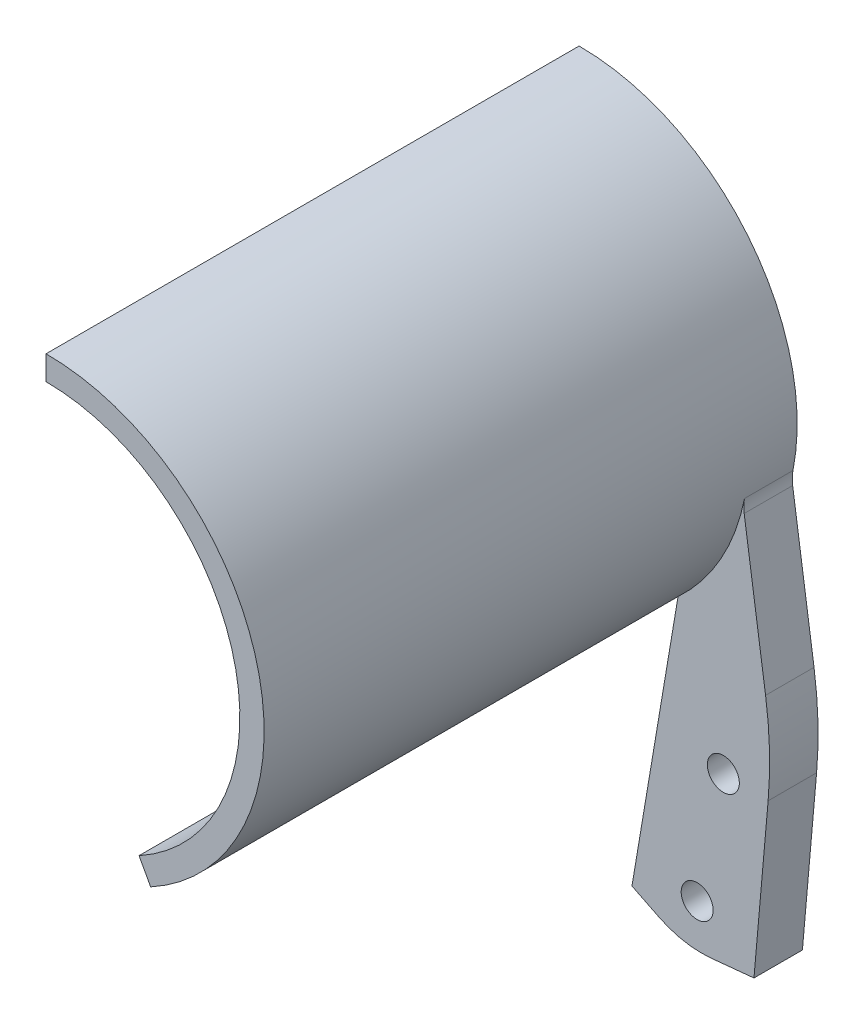
ISO-10303-21;
HEADER;
FILE_DESCRIPTION(('STEP AP214'),'2;1');
FILE_NAME('part.step','',(''),(''),'','','');
FILE_SCHEMA(('AUTOMOTIVE_DESIGN { 1 0 10303 214 1 1 1 1 }'));
ENDSEC;
DATA;
#1=APPLICATION_CONTEXT('core data for automotive mechanical design processes');
#2=APPLICATION_PROTOCOL_DEFINITION('international standard','automotive_design',2000,#1);
#3=PRODUCT_CONTEXT('',#1,'mechanical');
#4=PRODUCT('Part','Part','',(#3));
#5=PRODUCT_RELATED_PRODUCT_CATEGORY('part','',(#4));
#6=PRODUCT_DEFINITION_FORMATION('','',#4);
#7=PRODUCT_DEFINITION_CONTEXT('part definition',#1,'design');
#8=PRODUCT_DEFINITION('design','',#6,#7);
#9=PRODUCT_DEFINITION_SHAPE('','',#8);
#10=(LENGTH_UNIT() NAMED_UNIT(*) SI_UNIT(.MILLI.,.METRE.));
#11=(NAMED_UNIT(*) PLANE_ANGLE_UNIT() SI_UNIT($,.RADIAN.));
#12=(NAMED_UNIT(*) SI_UNIT($,.STERADIAN.) SOLID_ANGLE_UNIT());
#13=UNCERTAINTY_MEASURE_WITH_UNIT(LENGTH_MEASURE(1.E-05),#10,'distance_accuracy_value','');
#14=(GEOMETRIC_REPRESENTATION_CONTEXT(3) GLOBAL_UNCERTAINTY_ASSIGNED_CONTEXT((#13)) GLOBAL_UNIT_ASSIGNED_CONTEXT((#10,
#11,#12)) REPRESENTATION_CONTEXT('',''));
#15=CARTESIAN_POINT('',(0.,0.,0.));
#16=DIRECTION('',(0.,0.,1.));
#17=DIRECTION('',(1.,0.,0.));
#18=AXIS2_PLACEMENT_3D('',#15,#16,#17);
#19=CARTESIAN_POINT('',(-11.5,59.5,5.));
#20=DIRECTION('',(0.,0.,1.));
#21=DIRECTION('',(1.,0.,0.));
#22=AXIS2_PLACEMENT_3D('',#19,#20,#21);
#23=PLANE('',#22);
#24=CARTESIAN_POINT('',(-11.5,59.5,5.));
#25=DIRECTION('',(0.,0.,1.));
#26=DIRECTION('',(1.,0.,0.));
#27=AXIS2_PLACEMENT_3D('',#24,#25,#26);
#28=CIRCLE('',#27,22.5);
#29=CARTESIAN_POINT('',(3.70966057465962,42.9194021457715,5.));
#30=VERTEX_POINT('',#29);
#31=CARTESIAN_POINT('',(10.5660115908317,55.1021445597564,5.));
#32=VERTEX_POINT('',#31);
#33=EDGE_CURVE('E165',#30,#32,#28,.T.);
#34=ORIENTED_EDGE('',*,*,#33,.F.);
#35=DIRECTION('',(-0.166016316911046,-0.986123005775289,0.));
#36=VECTOR('',#35,1.);
#37=CARTESIAN_POINT('',(-1.04711146063493,14.6645750028113,5.));
#38=LINE('',#37,#36);
#39=CARTESIAN_POINT('',(-1.04711146063493,14.6645750028113,5.));
#40=VERTEX_POINT('',#39);
#41=EDGE_CURVE('E191',#30,#40,#38,.T.);
#42=ORIENTED_EDGE('',*,*,#41,.T.);
#43=DIRECTION('',(0.896009897531916,-0.444034079238121,0.));
#44=VECTOR('',#43,1.);
#45=CARTESIAN_POINT('',(-1.04711146063493,14.6645750028113,5.));
#46=LINE('',#45,#44);
#47=CARTESIAN_POINT('',(1.7101956104969,13.2981410941243,5.));
#48=VERTEX_POINT('',#47);
#49=EDGE_CURVE('E181',#40,#48,#46,.T.);
#50=ORIENTED_EDGE('',*,*,#49,.T.);
#51=CARTESIAN_POINT('',(6.15053640287812,22.2582400694434,5.));
#52=DIRECTION('',(0.,0.,1.));
#53=DIRECTION('',(1.,0.,0.));
#54=AXIS2_PLACEMENT_3D('',#51,#52,#53);
#55=CIRCLE('',#54,10.);
#56=CARTESIAN_POINT('',(7.13156192150099,12.3064769627467,5.));
#57=VERTEX_POINT('',#56);
#58=EDGE_CURVE('E11',#48,#57,#55,.T.);
#59=ORIENTED_EDGE('',*,*,#58,.T.);
#60=DIRECTION('',(0.995176310669676,0.0981025518622871,0.));
#61=VECTOR('',#60,1.);
#62=CARTESIAN_POINT('',(4.27874113591349,12.0252514190201,5.));
#63=LINE('',#62,#61);
#64=CARTESIAN_POINT('',(11.5398939036989,12.7410417853546,5.));
#65=VERTEX_POINT('',#64);
#66=EDGE_CURVE('E183',#57,#65,#63,.T.);
#67=ORIENTED_EDGE('',*,*,#66,.T.);
#68=DIRECTION('',(0.087970275032742,0.996123100179222,0.));
#69=VECTOR('',#68,1.);
#70=CARTESIAN_POINT('',(11.5398939036989,12.7410417853546,5.));
#71=LINE('',#70,#69);
#72=CARTESIAN_POINT('',(13.0029741208637,29.3080924304804,5.));
#73=VERTEX_POINT('',#72);
#74=EDGE_CURVE('E186',#65,#73,#71,.T.);
#75=ORIENTED_EDGE('',*,*,#74,.T.);
#76=CARTESIAN_POINT('',(-26.8419498863051,32.82690343179,5.));
#77=DIRECTION('',(0.,0.,1.));
#78=DIRECTION('',(1.,0.,0.));
#79=AXIS2_PLACEMENT_3D('',#76,#77,#78);
#80=CIRCLE('',#79,40.);
#81=CARTESIAN_POINT('',(12.7393102999379,38.5995840975582,5.));
#82=VERTEX_POINT('',#81);
#83=EDGE_CURVE('E242',#73,#82,#80,.T.);
#84=ORIENTED_EDGE('',*,*,#83,.T.);
#85=DIRECTION('',(-0.144317016644205,0.989531504656075,0.));
#86=VECTOR('',#85,1.);
#87=CARTESIAN_POINT('',(13.414614229585,33.9692603204855,5.));
#88=LINE('',#87,#86);
#89=CARTESIAN_POINT('',(10.5307320772442,53.7430355260251,5.));
#90=VERTEX_POINT('',#89);
#91=EDGE_CURVE('E189',#82,#90,#88,.T.);
#92=ORIENTED_EDGE('',*,*,#91,.T.);
#93=CARTESIAN_POINT('',(14.4888580958685,54.320303592602,5.));
#94=DIRECTION('',(0.,0.,1.));
#95=DIRECTION('',(1.,0.,0.));
#96=AXIS2_PLACEMENT_3D('',#93,#94,#95);
#97=CIRCLE('',#96,4.);
#98=EDGE_CURVE('E233',#90,#32,#97,.F.);
#99=ORIENTED_EDGE('',*,*,#98,.T.);
#100=EDGE_LOOP('',(#34,#42,#50,#59,#67,#75,#84,#92,#99));
#101=FACE_BOUND('',#100,.T.);
#102=CARTESIAN_POINT('',(5.67947549244537,16.6837506273747,5.));
#103=DIRECTION('',(0.,0.,1.));
#104=DIRECTION('',(1.,0.,0.));
#105=AXIS2_PLACEMENT_3D('',#102,#103,#104);
#106=CIRCLE('',#105,1.65);
#107=CARTESIAN_POINT('',(7.32947549244537,16.6837506273747,5.));
#108=VERTEX_POINT('',#107);
#109=EDGE_CURVE('E175',#108,#108,#106,.T.);
#110=ORIENTED_EDGE('',*,*,#109,.F.);
#111=EDGE_LOOP('',(#110));
#112=FACE_BOUND('',#111,.T.);
#113=CARTESIAN_POINT('',(8.38232747307616,29.3996694369142,5.));
#114=DIRECTION('',(0.,0.,1.));
#115=DIRECTION('',(1.,0.,0.));
#116=AXIS2_PLACEMENT_3D('',#113,#114,#115);
#117=CIRCLE('',#116,1.65);
#118=CARTESIAN_POINT('',(10.0323274730762,29.3996694369142,5.));
#119=VERTEX_POINT('',#118);
#120=EDGE_CURVE('E169',#119,#119,#117,.T.);
#121=ORIENTED_EDGE('',*,*,#120,.F.);
#122=EDGE_LOOP('',(#121));
#123=FACE_BOUND('',#122,.T.);
#124=ADVANCED_FACE('F39',(#101,#112,#123),#23,.T.);
#125=CARTESIAN_POINT('',(-11.5,59.5,0.));
#126=DIRECTION('',(0.,0.,1.));
#127=DIRECTION('',(1.,0.,0.));
#128=AXIS2_PLACEMENT_3D('',#125,#126,#127);
#129=PLANE('',#128);
#130=DIRECTION('',(-0.166016316911046,-0.986123005775289,0.));
#131=VECTOR('',#130,1.);
#132=CARTESIAN_POINT('',(-1.04711146063493,14.6645750028113,0.));
#133=LINE('',#132,#131);
#134=CARTESIAN_POINT('',(3.70966057465962,42.9194021457715,0.));
#135=VERTEX_POINT('',#134);
#136=CARTESIAN_POINT('',(-1.04711146063493,14.6645750028113,0.));
#137=VERTEX_POINT('',#136);
#138=EDGE_CURVE('E184',#135,#137,#133,.T.);
#139=ORIENTED_EDGE('',*,*,#138,.F.);
#140=CARTESIAN_POINT('',(-11.5,59.5,0.));
#141=DIRECTION('',(0.,0.,1.));
#142=DIRECTION('',(1.,0.,0.));
#143=AXIS2_PLACEMENT_3D('',#140,#141,#142);
#144=CIRCLE('',#143,22.5);
#145=CARTESIAN_POINT('',(-0.707567867346551,39.7573201246115,0.));
#146=VERTEX_POINT('',#145);
#147=EDGE_CURVE('E209',#146,#135,#144,.T.);
#148=ORIENTED_EDGE('',*,*,#147,.F.);
#149=DIRECTION('',(0.479663650340153,-0.877452438906155,0.));
#150=VECTOR('',#149,1.);
#151=CARTESIAN_POINT('',(-0.70756786734655,39.7573201246115,0.));
#152=LINE('',#151,#150);
#153=CARTESIAN_POINT('',(-1.90672699319694,41.9509512218769,0.));
#154=VERTEX_POINT('',#153);
#155=EDGE_CURVE('E140',#154,#146,#152,.T.);
#156=ORIENTED_EDGE('',*,*,#155,.F.);
#157=CARTESIAN_POINT('',(-11.5,59.5,0.));
#158=DIRECTION('',(0.,0.,-1.));
#159=DIRECTION('',(1.,0.,0.));
#160=AXIS2_PLACEMENT_3D('',#157,#158,#159);
#161=CIRCLE('',#160,20.);
#162=CARTESIAN_POINT('',(-11.5,79.5,0.));
#163=VERTEX_POINT('',#162);
#164=EDGE_CURVE('E206',#163,#154,#161,.T.);
#165=ORIENTED_EDGE('',*,*,#164,.F.);
#166=DIRECTION('',(0.,-1.,0.));
#167=VECTOR('',#166,1.);
#168=CARTESIAN_POINT('',(-11.5,79.5,0.));
#169=LINE('',#168,#167);
#170=CARTESIAN_POINT('',(-11.5,82.,0.));
#171=VERTEX_POINT('',#170);
#172=EDGE_CURVE('E204',#171,#163,#169,.T.);
#173=ORIENTED_EDGE('',*,*,#172,.F.);
#174=CARTESIAN_POINT('',(-11.5,59.5,0.));
#175=DIRECTION('',(0.,0.,1.));
#176=DIRECTION('',(1.,0.,0.));
#177=AXIS2_PLACEMENT_3D('',#174,#175,#176);
#178=CIRCLE('',#177,22.5);
#179=CARTESIAN_POINT('',(10.5660115908317,55.1021445597564,0.));
#180=VERTEX_POINT('',#179);
#181=EDGE_CURVE('E202',#180,#171,#178,.T.);
#182=ORIENTED_EDGE('',*,*,#181,.F.);
#183=CARTESIAN_POINT('',(14.4888580958685,54.320303592602,0.));
#184=DIRECTION('',(0.,0.,1.));
#185=DIRECTION('',(1.,0.,0.));
#186=AXIS2_PLACEMENT_3D('',#183,#184,#185);
#187=CIRCLE('',#186,4.);
#188=CARTESIAN_POINT('',(10.5307320772442,53.7430355260251,0.));
#189=VERTEX_POINT('',#188);
#190=EDGE_CURVE('E230',#180,#189,#187,.T.);
#191=ORIENTED_EDGE('',*,*,#190,.T.);
#192=DIRECTION('',(-0.144317016644205,0.989531504656075,0.));
#193=VECTOR('',#192,1.);
#194=CARTESIAN_POINT('',(13.414614229585,33.9692603204855,0.));
#195=LINE('',#194,#193);
#196=CARTESIAN_POINT('',(12.7393102999379,38.5995840975582,0.));
#197=VERTEX_POINT('',#196);
#198=EDGE_CURVE('E200',#197,#189,#195,.T.);
#199=ORIENTED_EDGE('',*,*,#198,.F.);
#200=CARTESIAN_POINT('',(-26.8419498863051,32.82690343179,0.));
#201=DIRECTION('',(0.,0.,1.));
#202=DIRECTION('',(1.,0.,0.));
#203=AXIS2_PLACEMENT_3D('',#200,#201,#202);
#204=CIRCLE('',#203,40.);
#205=CARTESIAN_POINT('',(13.0029741208637,29.3080924304804,0.));
#206=VERTEX_POINT('',#205);
#207=EDGE_CURVE('E238',#197,#206,#204,.F.);
#208=ORIENTED_EDGE('',*,*,#207,.T.);
#209=DIRECTION('',(0.087970275032742,0.996123100179222,0.));
#210=VECTOR('',#209,1.);
#211=CARTESIAN_POINT('',(11.5398939036989,12.7410417853546,0.));
#212=LINE('',#211,#210);
#213=CARTESIAN_POINT('',(11.5398939036989,12.7410417853546,0.));
#214=VERTEX_POINT('',#213);
#215=EDGE_CURVE('E197',#214,#206,#212,.T.);
#216=ORIENTED_EDGE('',*,*,#215,.F.);
#217=DIRECTION('',(0.995176310669676,0.0981025518622871,0.));
#218=VECTOR('',#217,1.);
#219=CARTESIAN_POINT('',(4.27874113591349,12.0252514190201,0.));
#220=LINE('',#219,#218);
#221=CARTESIAN_POINT('',(7.13156192150099,12.3064769627467,0.));
#222=VERTEX_POINT('',#221);
#223=EDGE_CURVE('E195',#222,#214,#220,.T.);
#224=ORIENTED_EDGE('',*,*,#223,.F.);
#225=CARTESIAN_POINT('',(6.15053640287812,22.2582400694434,0.));
#226=DIRECTION('',(0.,0.,1.));
#227=DIRECTION('',(1.,0.,0.));
#228=AXIS2_PLACEMENT_3D('',#225,#226,#227);
#229=CIRCLE('',#228,10.);
#230=CARTESIAN_POINT('',(1.7101956104969,13.2981410941243,0.));
#231=VERTEX_POINT('',#230);
#232=EDGE_CURVE('E61',#222,#231,#229,.F.);
#233=ORIENTED_EDGE('',*,*,#232,.T.);
#234=DIRECTION('',(0.896009897531916,-0.444034079238121,0.));
#235=VECTOR('',#234,1.);
#236=CARTESIAN_POINT('',(-1.04711146063493,14.6645750028113,0.));
#237=LINE('',#236,#235);
#238=EDGE_CURVE('E178',#137,#231,#237,.T.);
#239=ORIENTED_EDGE('',*,*,#238,.F.);
#240=EDGE_LOOP('',(#139,#148,#156,#165,#173,#182,#191,#199,#208,#216,#224,#233,#239));
#241=FACE_BOUND('',#240,.T.);
#242=CARTESIAN_POINT('',(5.67947549244537,16.6837506273747,0.));
#243=DIRECTION('',(0.,0.,1.));
#244=DIRECTION('',(1.,0.,0.));
#245=AXIS2_PLACEMENT_3D('',#242,#243,#244);
#246=CIRCLE('',#245,1.65);
#247=CARTESIAN_POINT('',(7.32947549244537,16.6837506273747,0.));
#248=VERTEX_POINT('',#247);
#249=EDGE_CURVE('E172',#248,#248,#246,.T.);
#250=ORIENTED_EDGE('',*,*,#249,.T.);
#251=EDGE_LOOP('',(#250));
#252=FACE_BOUND('',#251,.T.);
#253=CARTESIAN_POINT('',(8.38232747307616,29.3996694369142,0.));
#254=DIRECTION('',(0.,0.,1.));
#255=DIRECTION('',(1.,0.,0.));
#256=AXIS2_PLACEMENT_3D('',#253,#254,#255);
#257=CIRCLE('',#256,1.65);
#258=CARTESIAN_POINT('',(10.0323274730762,29.3996694369142,0.));
#259=VERTEX_POINT('',#258);
#260=EDGE_CURVE('E168',#259,#259,#257,.T.);
#261=ORIENTED_EDGE('',*,*,#260,.T.);
#262=EDGE_LOOP('',(#261));
#263=FACE_BOUND('',#262,.T.);
#264=ADVANCED_FACE('F256',(#241,#252,#263),#129,.F.);
#265=CARTESIAN_POINT('',(-1.04711146063493,14.6645750028113,5.));
#266=DIRECTION('',(0.444034079238121,0.896009897531916,0.));
#267=DIRECTION('',(-0.896009897531916,0.444034079238121,0.));
#268=AXIS2_PLACEMENT_3D('',#265,#266,#267);
#269=PLANE('',#268);
#270=ORIENTED_EDGE('',*,*,#238,.T.);
#271=DIRECTION('',(0.,0.,-1.));
#272=VECTOR('',#271,1.);
#273=CARTESIAN_POINT('',(1.7101956104969,13.2981410941243,5.));
#274=LINE('',#273,#272);
#275=EDGE_CURVE('E47',#231,#48,#274,.F.);
#276=ORIENTED_EDGE('',*,*,#275,.T.);
#277=ORIENTED_EDGE('',*,*,#49,.F.);
#278=DIRECTION('',(0.,0.,-1.));
#279=VECTOR('',#278,1.);
#280=CARTESIAN_POINT('',(-1.04711146063493,14.6645750028113,5.));
#281=LINE('',#280,#279);
#282=EDGE_CURVE('E193',#40,#137,#281,.T.);
#283=ORIENTED_EDGE('',*,*,#282,.T.);
#284=EDGE_LOOP('',(#270,#276,#277,#283));
#285=FACE_BOUND('',#284,.T.);
#286=ADVANCED_FACE('F282',(#285),#269,.F.);
#287=CARTESIAN_POINT('',(4.27874113591349,12.0252514190201,5.));
#288=DIRECTION('',(-0.0981025518622871,0.995176310669676,0.));
#289=DIRECTION('',(-0.995176310669676,-0.0981025518622871,0.));
#290=AXIS2_PLACEMENT_3D('',#287,#288,#289);
#291=PLANE('',#290);
#292=ORIENTED_EDGE('',*,*,#66,.F.);
#293=DIRECTION('',(0.,0.,-1.));
#294=VECTOR('',#293,1.);
#295=CARTESIAN_POINT('',(7.13156192150099,12.3064769627467,5.));
#296=LINE('',#295,#294);
#297=EDGE_CURVE('E244',#57,#222,#296,.T.);
#298=ORIENTED_EDGE('',*,*,#297,.T.);
#299=ORIENTED_EDGE('',*,*,#223,.T.);
#300=DIRECTION('',(0.,0.,-1.));
#301=VECTOR('',#300,1.);
#302=CARTESIAN_POINT('',(11.5398939036989,12.7410417853546,5.));
#303=LINE('',#302,#301);
#304=EDGE_CURVE('E221',#65,#214,#303,.T.);
#305=ORIENTED_EDGE('',*,*,#304,.F.);
#306=EDGE_LOOP('',(#292,#298,#299,#305));
#307=FACE_BOUND('',#306,.T.);
#308=ADVANCED_FACE('F250',(#307),#291,.F.);
#309=CARTESIAN_POINT('',(11.5398939036989,12.7410417853546,5.));
#310=DIRECTION('',(-0.996123100179222,0.087970275032742,0.));
#311=DIRECTION('',(-0.087970275032742,-0.996123100179222,0.));
#312=AXIS2_PLACEMENT_3D('',#309,#310,#311);
#313=PLANE('',#312);
#314=ORIENTED_EDGE('',*,*,#215,.T.);
#315=DIRECTION('',(0.,0.,-1.));
#316=VECTOR('',#315,1.);
#317=CARTESIAN_POINT('',(13.0029741208637,29.3080924304804,5.));
#318=LINE('',#317,#316);
#319=EDGE_CURVE('E240',#206,#73,#318,.F.);
#320=ORIENTED_EDGE('',*,*,#319,.T.);
#321=ORIENTED_EDGE('',*,*,#74,.F.);
#322=ORIENTED_EDGE('',*,*,#304,.T.);
#323=EDGE_LOOP('',(#314,#320,#321,#322));
#324=FACE_BOUND('',#323,.T.);
#325=ADVANCED_FACE('F261',(#324),#313,.F.);
#326=CARTESIAN_POINT('',(13.414614229585,33.9692603204855,5.));
#327=DIRECTION('',(-0.989531504656075,-0.144317016644205,0.));
#328=DIRECTION('',(0.144317016644205,-0.989531504656075,0.));
#329=AXIS2_PLACEMENT_3D('',#326,#327,#328);
#330=PLANE('',#329);
#331=ORIENTED_EDGE('',*,*,#91,.F.);
#332=DIRECTION('',(0.,0.,-1.));
#333=VECTOR('',#332,1.);
#334=CARTESIAN_POINT('',(12.7393102999379,38.5995840975582,5.));
#335=LINE('',#334,#333);
#336=EDGE_CURVE('E235',#82,#197,#335,.T.);
#337=ORIENTED_EDGE('',*,*,#336,.T.);
#338=ORIENTED_EDGE('',*,*,#198,.T.);
#339=DIRECTION('',(0.,0.,1.));
#340=VECTOR('',#339,1.);
#341=CARTESIAN_POINT('',(10.5307320772442,53.7430355260251,5.));
#342=LINE('',#341,#340);
#343=EDGE_CURVE('E227',#189,#90,#342,.T.);
#344=ORIENTED_EDGE('',*,*,#343,.T.);
#345=EDGE_LOOP('',(#331,#337,#338,#344));
#346=FACE_BOUND('',#345,.T.);
#347=ADVANCED_FACE('F271',(#346),#330,.F.);
#348=CARTESIAN_POINT('',(-11.5,79.5,5.));
#349=DIRECTION('',(1.,0.,0.));
#350=DIRECTION('',(0.,1.,0.));
#351=AXIS2_PLACEMENT_3D('',#348,#349,#350);
#352=PLANE('',#351);
#353=ORIENTED_EDGE('',*,*,#172,.T.);
#354=DIRECTION('',(0.,0.,-1.));
#355=VECTOR('',#354,1.);
#356=CARTESIAN_POINT('',(-11.5,79.5,5.));
#357=LINE('',#356,#355);
#358=CARTESIAN_POINT('',(-11.5,79.5,55.));
#359=VERTEX_POINT('',#358);
#360=EDGE_CURVE('E217',#359,#163,#357,.T.);
#361=ORIENTED_EDGE('',*,*,#360,.F.);
#362=DIRECTION('',(0.,1.,0.));
#363=VECTOR('',#362,1.);
#364=CARTESIAN_POINT('',(-11.5,82.,55.));
#365=LINE('',#364,#363);
#366=CARTESIAN_POINT('',(-11.5,82.,55.));
#367=VERTEX_POINT('',#366);
#368=EDGE_CURVE('E163',#359,#367,#365,.T.);
#369=ORIENTED_EDGE('',*,*,#368,.T.);
#370=DIRECTION('',(0.,0.,-1.));
#371=VECTOR('',#370,1.);
#372=CARTESIAN_POINT('',(-11.5,82.,5.));
#373=LINE('',#372,#371);
#374=EDGE_CURVE('E159',#367,#171,#373,.T.);
#375=ORIENTED_EDGE('',*,*,#374,.T.);
#376=EDGE_LOOP('',(#353,#361,#369,#375));
#377=FACE_BOUND('',#376,.T.);
#378=ADVANCED_FACE('F308',(#377),#352,.F.);
#379=CARTESIAN_POINT('',(-11.5,59.5,5.));
#380=DIRECTION('',(0.,0.,-1.));
#381=DIRECTION('',(-1.,0.,0.));
#382=AXIS2_PLACEMENT_3D('',#379,#380,#381);
#383=CYLINDRICAL_SURFACE('',#382,20.);
#384=ORIENTED_EDGE('',*,*,#164,.T.);
#385=DIRECTION('',(0.,0.,-1.));
#386=VECTOR('',#385,1.);
#387=CARTESIAN_POINT('',(-1.90672699319694,41.9509512218769,5.));
#388=LINE('',#387,#386);
#389=CARTESIAN_POINT('',(-1.90672699319693,41.9509512218769,55.));
#390=VERTEX_POINT('',#389);
#391=EDGE_CURVE('E144',#390,#154,#388,.T.);
#392=ORIENTED_EDGE('',*,*,#391,.F.);
#393=CARTESIAN_POINT('',(-11.5,59.5,55.));
#394=DIRECTION('',(0.,0.,1.));
#395=DIRECTION('',(-1.,0.,0.));
#396=AXIS2_PLACEMENT_3D('',#393,#394,#395);
#397=CIRCLE('',#396,20.);
#398=EDGE_CURVE('E155',#390,#359,#397,.T.);
#399=ORIENTED_EDGE('',*,*,#398,.T.);
#400=ORIENTED_EDGE('',*,*,#360,.T.);
#401=EDGE_LOOP('',(#384,#392,#399,#400));
#402=FACE_BOUND('',#401,.T.);
#403=ADVANCED_FACE('F305',(#402),#383,.F.);
#404=CARTESIAN_POINT('',(-0.70756786734655,39.7573201246115,5.));
#405=DIRECTION('',(0.877452438906155,0.479663650340153,0.));
#406=DIRECTION('',(-0.479663650340153,0.877452438906155,0.));
#407=AXIS2_PLACEMENT_3D('',#404,#405,#406);
#408=PLANE('',#407);
#409=ORIENTED_EDGE('',*,*,#155,.T.);
#410=DIRECTION('',(0.,0.,-1.));
#411=VECTOR('',#410,1.);
#412=CARTESIAN_POINT('',(-0.707567867346551,39.7573201246115,5.));
#413=LINE('',#412,#411);
#414=CARTESIAN_POINT('',(-0.707567867346551,39.7573201246115,55.));
#415=VERTEX_POINT('',#414);
#416=EDGE_CURVE('E134',#415,#146,#413,.T.);
#417=ORIENTED_EDGE('',*,*,#416,.F.);
#418=DIRECTION('',(-0.479663650340152,0.877452438906155,0.));
#419=VECTOR('',#418,1.);
#420=CARTESIAN_POINT('',(-1.90672699319694,41.9509512218769,55.));
#421=LINE('',#420,#419);
#422=EDGE_CURVE('E138',#415,#390,#421,.T.);
#423=ORIENTED_EDGE('',*,*,#422,.T.);
#424=ORIENTED_EDGE('',*,*,#391,.T.);
#425=EDGE_LOOP('',(#409,#417,#423,#424));
#426=FACE_BOUND('',#425,.T.);
#427=ADVANCED_FACE('F136',(#426),#408,.F.);
#428=CARTESIAN_POINT('',(-11.5,59.5,5.));
#429=DIRECTION('',(0.,0.,-1.));
#430=DIRECTION('',(-1.,0.,0.));
#431=AXIS2_PLACEMENT_3D('',#428,#429,#430);
#432=CYLINDRICAL_SURFACE('',#431,22.5);
#433=ORIENTED_EDGE('',*,*,#147,.T.);
#434=DIRECTION('',(0.,0.,-1.));
#435=VECTOR('',#434,1.);
#436=CARTESIAN_POINT('',(3.70966057465962,42.9194021457715,5.));
#437=LINE('',#436,#435);
#438=EDGE_CURVE('E145',#30,#135,#437,.T.);
#439=ORIENTED_EDGE('',*,*,#438,.F.);
#440=ORIENTED_EDGE('',*,*,#33,.T.);
#441=DIRECTION('',(0.,0.,-1.));
#442=VECTOR('',#441,1.);
#443=CARTESIAN_POINT('',(10.5660115908317,55.1021445597564,5.));
#444=LINE('',#443,#442);
#445=EDGE_CURVE('E224',#32,#180,#444,.T.);
#446=ORIENTED_EDGE('',*,*,#445,.T.);
#447=ORIENTED_EDGE('',*,*,#181,.T.);
#448=ORIENTED_EDGE('',*,*,#374,.F.);
#449=CARTESIAN_POINT('',(-11.5,59.5,55.));
#450=DIRECTION('',(0.,0.,-1.));
#451=DIRECTION('',(-1.,0.,0.));
#452=AXIS2_PLACEMENT_3D('',#449,#450,#451);
#453=CIRCLE('',#452,22.5);
#454=EDGE_CURVE('E152',#367,#415,#453,.T.);
#455=ORIENTED_EDGE('',*,*,#454,.T.);
#456=ORIENTED_EDGE('',*,*,#416,.T.);
#457=EDGE_LOOP('',(#433,#439,#440,#446,#447,#448,#455,#456));
#458=FACE_BOUND('',#457,.T.);
#459=ADVANCED_FACE('F157',(#458),#432,.T.);
#460=CARTESIAN_POINT('',(-1.04711146063493,14.6645750028113,5.));
#461=DIRECTION('',(0.986123005775289,-0.166016316911046,0.));
#462=DIRECTION('',(0.166016316911046,0.986123005775289,0.));
#463=AXIS2_PLACEMENT_3D('',#460,#461,#462);
#464=PLANE('',#463);
#465=ORIENTED_EDGE('',*,*,#138,.T.);
#466=ORIENTED_EDGE('',*,*,#282,.F.);
#467=ORIENTED_EDGE('',*,*,#41,.F.);
#468=ORIENTED_EDGE('',*,*,#438,.T.);
#469=EDGE_LOOP('',(#465,#466,#467,#468));
#470=FACE_BOUND('',#469,.T.);
#471=ADVANCED_FACE('F281',(#470),#464,.F.);
#472=CARTESIAN_POINT('',(5.67947549244537,16.6837506273747,5.));
#473=DIRECTION('',(0.,0.,-1.));
#474=DIRECTION('',(-1.,0.,0.));
#475=AXIS2_PLACEMENT_3D('',#472,#473,#474);
#476=CYLINDRICAL_SURFACE('',#475,1.65);
#477=ORIENTED_EDGE('',*,*,#109,.T.);
#478=EDGE_LOOP('',(#477));
#479=FACE_BOUND('',#478,.T.);
#480=ORIENTED_EDGE('',*,*,#249,.F.);
#481=EDGE_LOOP('',(#480));
#482=FACE_BOUND('',#481,.T.);
#483=ADVANCED_FACE('F296',(#479,#482),#476,.F.);
#484=CARTESIAN_POINT('',(8.38232747307616,29.3996694369142,5.));
#485=DIRECTION('',(0.,0.,-1.));
#486=DIRECTION('',(-1.,0.,0.));
#487=AXIS2_PLACEMENT_3D('',#484,#485,#486);
#488=CYLINDRICAL_SURFACE('',#487,1.65);
#489=ORIENTED_EDGE('',*,*,#120,.T.);
#490=EDGE_LOOP('',(#489));
#491=FACE_BOUND('',#490,.T.);
#492=ORIENTED_EDGE('',*,*,#260,.F.);
#493=EDGE_LOOP('',(#492));
#494=FACE_BOUND('',#493,.T.);
#495=ADVANCED_FACE('F322',(#491,#494),#488,.F.);
#496=CARTESIAN_POINT('',(14.4888580958685,54.320303592602,5.));
#497=DIRECTION('',(0.,0.,-1.));
#498=DIRECTION('',(-1.,0.,0.));
#499=AXIS2_PLACEMENT_3D('',#496,#497,#498);
#500=CYLINDRICAL_SURFACE('',#499,4.);
#501=ORIENTED_EDGE('',*,*,#98,.F.);
#502=ORIENTED_EDGE('',*,*,#343,.F.);
#503=ORIENTED_EDGE('',*,*,#190,.F.);
#504=ORIENTED_EDGE('',*,*,#445,.F.);
#505=EDGE_LOOP('',(#501,#502,#503,#504));
#506=FACE_BOUND('',#505,.T.);
#507=ADVANCED_FACE('F276',(#506),#500,.F.);
#508=CARTESIAN_POINT('',(-26.8419498863051,32.82690343179,5.));
#509=DIRECTION('',(0.,0.,-1.));
#510=DIRECTION('',(-1.,0.,0.));
#511=AXIS2_PLACEMENT_3D('',#508,#509,#510);
#512=CYLINDRICAL_SURFACE('',#511,40.);
#513=ORIENTED_EDGE('',*,*,#83,.F.);
#514=ORIENTED_EDGE('',*,*,#319,.F.);
#515=ORIENTED_EDGE('',*,*,#207,.F.);
#516=ORIENTED_EDGE('',*,*,#336,.F.);
#517=EDGE_LOOP('',(#513,#514,#515,#516));
#518=FACE_BOUND('',#517,.T.);
#519=ADVANCED_FACE('F265',(#518),#512,.T.);
#520=CARTESIAN_POINT('',(6.15053640287812,22.2582400694434,5.));
#521=DIRECTION('',(0.,0.,-1.));
#522=DIRECTION('',(-1.,0.,0.));
#523=AXIS2_PLACEMENT_3D('',#520,#521,#522);
#524=CYLINDRICAL_SURFACE('',#523,10.);
#525=ORIENTED_EDGE('',*,*,#58,.F.);
#526=ORIENTED_EDGE('',*,*,#275,.F.);
#527=ORIENTED_EDGE('',*,*,#232,.F.);
#528=ORIENTED_EDGE('',*,*,#297,.F.);
#529=EDGE_LOOP('',(#525,#526,#527,#528));
#530=FACE_BOUND('',#529,.T.);
#531=ADVANCED_FACE('F41',(#530),#524,.T.);
#532=CARTESIAN_POINT('',(-11.5,59.5,55.));
#533=DIRECTION('',(0.,0.,-1.));
#534=DIRECTION('',(-1.,0.,0.));
#535=AXIS2_PLACEMENT_3D('',#532,#533,#534);
#536=PLANE('',#535);
#537=ORIENTED_EDGE('',*,*,#454,.F.);
#538=ORIENTED_EDGE('',*,*,#368,.F.);
#539=ORIENTED_EDGE('',*,*,#398,.F.);
#540=ORIENTED_EDGE('',*,*,#422,.F.);
#541=EDGE_LOOP('',(#537,#538,#539,#540));
#542=FACE_BOUND('',#541,.T.);
#543=ADVANCED_FACE('F150',(#542),#536,.F.);
#544=CLOSED_SHELL('',(#124,#264,#286,#308,#325,#347,#378,#403,#427,#459,#471,#483,#495,#507,
#519,#531,#543));
#545=MANIFOLD_SOLID_BREP('B2',#544);
#546=ADVANCED_BREP_SHAPE_REPRESENTATION('',(#18,#545),#14);
#547=SHAPE_DEFINITION_REPRESENTATION(#9,#546);
ENDSEC;
END-ISO-10303-21;
